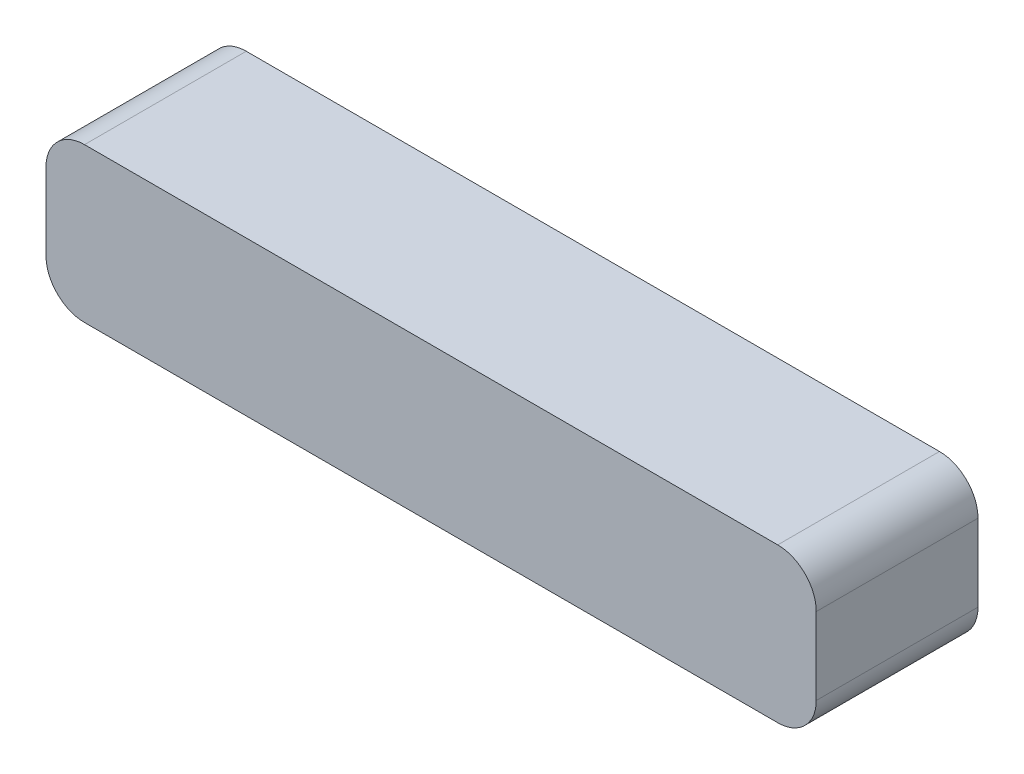
ISO-10303-21;
HEADER;
FILE_DESCRIPTION(('STEP AP214'),'2;1');
FILE_NAME('part.step','',(''),(''),'','','');
FILE_SCHEMA(('AUTOMOTIVE_DESIGN { 1 0 10303 214 1 1 1 1 }'));
ENDSEC;
DATA;
#1=APPLICATION_CONTEXT('core data for automotive mechanical design processes');
#2=APPLICATION_PROTOCOL_DEFINITION('international standard','automotive_design',2000,#1);
#3=PRODUCT_CONTEXT('',#1,'mechanical');
#4=PRODUCT('Part','Part','',(#3));
#5=PRODUCT_RELATED_PRODUCT_CATEGORY('part','',(#4));
#6=PRODUCT_DEFINITION_FORMATION('','',#4);
#7=PRODUCT_DEFINITION_CONTEXT('part definition',#1,'design');
#8=PRODUCT_DEFINITION('design','',#6,#7);
#9=PRODUCT_DEFINITION_SHAPE('','',#8);
#10=(LENGTH_UNIT() NAMED_UNIT(*) SI_UNIT(.MILLI.,.METRE.));
#11=(NAMED_UNIT(*) PLANE_ANGLE_UNIT() SI_UNIT($,.RADIAN.));
#12=(NAMED_UNIT(*) SI_UNIT($,.STERADIAN.) SOLID_ANGLE_UNIT());
#13=UNCERTAINTY_MEASURE_WITH_UNIT(LENGTH_MEASURE(1.E-05),#10,'distance_accuracy_value','');
#14=(GEOMETRIC_REPRESENTATION_CONTEXT(3) GLOBAL_UNCERTAINTY_ASSIGNED_CONTEXT((#13)) GLOBAL_UNIT_ASSIGNED_CONTEXT((#10,
#11,#12)) REPRESENTATION_CONTEXT('',''));
#15=CARTESIAN_POINT('',(0.,0.,0.));
#16=DIRECTION('',(0.,0.,1.));
#17=DIRECTION('',(1.,0.,0.));
#18=AXIS2_PLACEMENT_3D('',#15,#16,#17);
#19=CARTESIAN_POINT('',(-45.,9.,0.));
#20=DIRECTION('',(0.,-1.,0.));
#21=DIRECTION('',(0.,0.,-1.));
#22=AXIS2_PLACEMENT_3D('',#19,#20,#21);
#23=PLANE('',#22);
#24=DIRECTION('',(0.,0.,1.));
#25=VECTOR('',#24,1.);
#26=CARTESIAN_POINT('',(-45.,9.,10.));
#27=LINE('',#26,#25);
#28=CARTESIAN_POINT('',(-45.,9.,0.));
#29=VERTEX_POINT('',#28);
#30=CARTESIAN_POINT('',(-45.,9.,20.));
#31=VERTEX_POINT('',#30);
#32=EDGE_CURVE('E216',#29,#31,#27,.T.);
#33=ORIENTED_EDGE('',*,*,#32,.F.);
#34=DIRECTION('',(1.,0.,0.));
#35=VECTOR('',#34,1.);
#36=CARTESIAN_POINT('',(0.,9.,0.));
#37=LINE('',#36,#35);
#38=CARTESIAN_POINT('',(45.,9.,0.));
#39=VERTEX_POINT('',#38);
#40=EDGE_CURVE('E234',#29,#39,#37,.T.);
#41=ORIENTED_EDGE('',*,*,#40,.T.);
#42=DIRECTION('',(0.,0.,1.));
#43=VECTOR('',#42,1.);
#44=CARTESIAN_POINT('',(45.,9.,10.));
#45=LINE('',#44,#43);
#46=CARTESIAN_POINT('',(45.,9.,20.));
#47=VERTEX_POINT('',#46);
#48=EDGE_CURVE('E11',#39,#47,#45,.T.);
#49=ORIENTED_EDGE('',*,*,#48,.T.);
#50=DIRECTION('',(1.,0.,0.));
#51=VECTOR('',#50,1.);
#52=CARTESIAN_POINT('',(0.,9.,20.));
#53=LINE('',#52,#51);
#54=EDGE_CURVE('E323',#31,#47,#53,.T.);
#55=ORIENTED_EDGE('',*,*,#54,.F.);
#56=EDGE_LOOP('',(#33,#41,#49,#55));
#57=FACE_BOUND('',#56,.T.);
#58=ADVANCED_FACE('F17',(#57),#23,.T.);
#59=CARTESIAN_POINT('',(45.,5.,10.));
#60=DIRECTION('',(0.,0.,1.));
#61=DIRECTION('',(1.,0.,0.));
#62=AXIS2_PLACEMENT_3D('',#59,#60,#61);
#63=CYLINDRICAL_SURFACE('',#62,4.);
#64=CARTESIAN_POINT('',(45.,5.,20.));
#65=DIRECTION('',(0.,0.,1.));
#66=DIRECTION('',(1.,0.,0.));
#67=AXIS2_PLACEMENT_3D('',#64,#65,#66);
#68=CIRCLE('',#67,4.);
#69=CARTESIAN_POINT('',(49.,5.,20.));
#70=VERTEX_POINT('',#69);
#71=EDGE_CURVE('E327',#70,#47,#68,.T.);
#72=ORIENTED_EDGE('',*,*,#71,.T.);
#73=ORIENTED_EDGE('',*,*,#48,.F.);
#74=CARTESIAN_POINT('',(45.,5.,0.));
#75=DIRECTION('',(0.,0.,1.));
#76=DIRECTION('',(1.,0.,0.));
#77=AXIS2_PLACEMENT_3D('',#74,#75,#76);
#78=CIRCLE('',#77,4.);
#79=CARTESIAN_POINT('',(49.,5.,0.));
#80=VERTEX_POINT('',#79);
#81=EDGE_CURVE('E341',#80,#39,#78,.T.);
#82=ORIENTED_EDGE('',*,*,#81,.F.);
#83=DIRECTION('',(0.,0.,1.));
#84=VECTOR('',#83,1.);
#85=CARTESIAN_POINT('',(49.,5.,10.));
#86=LINE('',#85,#84);
#87=EDGE_CURVE('E28',#80,#70,#86,.T.);
#88=ORIENTED_EDGE('',*,*,#87,.T.);
#89=EDGE_LOOP('',(#72,#73,#82,#88));
#90=FACE_BOUND('',#89,.T.);
#91=ADVANCED_FACE('F19',(#90),#63,.F.);
#92=CARTESIAN_POINT('',(49.,-5.,0.));
#93=DIRECTION('',(1.,0.,0.));
#94=DIRECTION('',(0.,1.,0.));
#95=AXIS2_PLACEMENT_3D('',#92,#93,#94);
#96=PLANE('',#95);
#97=DIRECTION('',(0.,1.,0.));
#98=VECTOR('',#97,1.);
#99=CARTESIAN_POINT('',(49.,0.,20.));
#100=LINE('',#99,#98);
#101=CARTESIAN_POINT('',(49.,-5.,20.));
#102=VERTEX_POINT('',#101);
#103=EDGE_CURVE('E277',#102,#70,#100,.T.);
#104=ORIENTED_EDGE('',*,*,#103,.T.);
#105=ORIENTED_EDGE('',*,*,#87,.F.);
#106=DIRECTION('',(0.,1.,0.));
#107=VECTOR('',#106,1.);
#108=CARTESIAN_POINT('',(49.,0.,0.));
#109=LINE('',#108,#107);
#110=CARTESIAN_POINT('',(49.,-5.,0.));
#111=VERTEX_POINT('',#110);
#112=EDGE_CURVE('E337',#111,#80,#109,.T.);
#113=ORIENTED_EDGE('',*,*,#112,.F.);
#114=DIRECTION('',(0.,0.,1.));
#115=VECTOR('',#114,1.);
#116=CARTESIAN_POINT('',(49.,-5.,10.));
#117=LINE('',#116,#115);
#118=EDGE_CURVE('E291',#111,#102,#117,.T.);
#119=ORIENTED_EDGE('',*,*,#118,.T.);
#120=EDGE_LOOP('',(#104,#105,#113,#119));
#121=FACE_BOUND('',#120,.T.);
#122=ADVANCED_FACE('F508',(#121),#96,.F.);
#123=CARTESIAN_POINT('',(45.,-5.,10.));
#124=DIRECTION('',(0.,0.,1.));
#125=DIRECTION('',(0.,-1.,0.));
#126=AXIS2_PLACEMENT_3D('',#123,#124,#125);
#127=CYLINDRICAL_SURFACE('',#126,4.);
#128=CARTESIAN_POINT('',(45.,-5.,20.));
#129=DIRECTION('',(0.,0.,1.));
#130=DIRECTION('',(1.,0.,0.));
#131=AXIS2_PLACEMENT_3D('',#128,#129,#130);
#132=CIRCLE('',#131,4.);
#133=CARTESIAN_POINT('',(45.,-9.,20.));
#134=VERTEX_POINT('',#133);
#135=EDGE_CURVE('E272',#134,#102,#132,.T.);
#136=ORIENTED_EDGE('',*,*,#135,.T.);
#137=ORIENTED_EDGE('',*,*,#118,.F.);
#138=CARTESIAN_POINT('',(45.,-5.,0.));
#139=DIRECTION('',(0.,0.,1.));
#140=DIRECTION('',(1.,0.,0.));
#141=AXIS2_PLACEMENT_3D('',#138,#139,#140);
#142=CIRCLE('',#141,4.);
#143=CARTESIAN_POINT('',(45.,-9.,0.));
#144=VERTEX_POINT('',#143);
#145=EDGE_CURVE('E342',#144,#111,#142,.T.);
#146=ORIENTED_EDGE('',*,*,#145,.F.);
#147=DIRECTION('',(0.,0.,1.));
#148=VECTOR('',#147,1.);
#149=CARTESIAN_POINT('',(45.,-9.,10.));
#150=LINE('',#149,#148);
#151=EDGE_CURVE('E289',#144,#134,#150,.T.);
#152=ORIENTED_EDGE('',*,*,#151,.T.);
#153=EDGE_LOOP('',(#136,#137,#146,#152));
#154=FACE_BOUND('',#153,.T.);
#155=ADVANCED_FACE('F562',(#154),#127,.F.);
#156=CARTESIAN_POINT('',(45.,-9.,0.));
#157=DIRECTION('',(0.,1.,0.));
#158=DIRECTION('',(1.,0.,0.));
#159=AXIS2_PLACEMENT_3D('',#156,#157,#158);
#160=PLANE('',#159);
#161=ORIENTED_EDGE('',*,*,#151,.F.);
#162=DIRECTION('',(-1.,0.,0.));
#163=VECTOR('',#162,1.);
#164=CARTESIAN_POINT('',(0.,-9.,0.));
#165=LINE('',#164,#163);
#166=CARTESIAN_POINT('',(-45.,-9.,0.));
#167=VERTEX_POINT('',#166);
#168=EDGE_CURVE('E296',#144,#167,#165,.T.);
#169=ORIENTED_EDGE('',*,*,#168,.T.);
#170=DIRECTION('',(0.,0.,1.));
#171=VECTOR('',#170,1.);
#172=CARTESIAN_POINT('',(-45.,-9.,10.));
#173=LINE('',#172,#171);
#174=CARTESIAN_POINT('',(-45.,-9.,20.));
#175=VERTEX_POINT('',#174);
#176=EDGE_CURVE('E292',#167,#175,#173,.T.);
#177=ORIENTED_EDGE('',*,*,#176,.T.);
#178=DIRECTION('',(-1.,0.,0.));
#179=VECTOR('',#178,1.);
#180=CARTESIAN_POINT('',(0.,-9.,20.));
#181=LINE('',#180,#179);
#182=EDGE_CURVE('E276',#134,#175,#181,.T.);
#183=ORIENTED_EDGE('',*,*,#182,.F.);
#184=EDGE_LOOP('',(#161,#169,#177,#183));
#185=FACE_BOUND('',#184,.T.);
#186=ADVANCED_FACE('F566',(#185),#160,.T.);
#187=CARTESIAN_POINT('',(-45.,-5.,10.));
#188=DIRECTION('',(0.,0.,1.));
#189=DIRECTION('',(-1.,0.,0.));
#190=AXIS2_PLACEMENT_3D('',#187,#188,#189);
#191=CYLINDRICAL_SURFACE('',#190,4.);
#192=CARTESIAN_POINT('',(-45.,-5.,20.));
#193=DIRECTION('',(0.,0.,1.));
#194=DIRECTION('',(1.,0.,0.));
#195=AXIS2_PLACEMENT_3D('',#192,#193,#194);
#196=CIRCLE('',#195,4.);
#197=CARTESIAN_POINT('',(-49.,-5.,20.));
#198=VERTEX_POINT('',#197);
#199=EDGE_CURVE('E348',#198,#175,#196,.T.);
#200=ORIENTED_EDGE('',*,*,#199,.T.);
#201=ORIENTED_EDGE('',*,*,#176,.F.);
#202=CARTESIAN_POINT('',(-45.,-5.,0.));
#203=DIRECTION('',(0.,0.,1.));
#204=DIRECTION('',(1.,0.,0.));
#205=AXIS2_PLACEMENT_3D('',#202,#203,#204);
#206=CIRCLE('',#205,4.);
#207=CARTESIAN_POINT('',(-49.,-5.,0.));
#208=VERTEX_POINT('',#207);
#209=EDGE_CURVE('E227',#208,#167,#206,.T.);
#210=ORIENTED_EDGE('',*,*,#209,.F.);
#211=DIRECTION('',(0.,0.,1.));
#212=VECTOR('',#211,1.);
#213=CARTESIAN_POINT('',(-49.,-5.,10.));
#214=LINE('',#213,#212);
#215=EDGE_CURVE('E222',#208,#198,#214,.T.);
#216=ORIENTED_EDGE('',*,*,#215,.T.);
#217=EDGE_LOOP('',(#200,#201,#210,#216));
#218=FACE_BOUND('',#217,.T.);
#219=ADVANCED_FACE('F613',(#218),#191,.F.);
#220=CARTESIAN_POINT('',(-49.,5.,0.));
#221=DIRECTION('',(-1.,0.,0.));
#222=DIRECTION('',(0.,0.,1.));
#223=AXIS2_PLACEMENT_3D('',#220,#221,#222);
#224=PLANE('',#223);
#225=DIRECTION('',(0.,-1.,0.));
#226=VECTOR('',#225,1.);
#227=CARTESIAN_POINT('',(-49.,0.,20.));
#228=LINE('',#227,#226);
#229=CARTESIAN_POINT('',(-49.,5.,20.));
#230=VERTEX_POINT('',#229);
#231=EDGE_CURVE('E266',#230,#198,#228,.T.);
#232=ORIENTED_EDGE('',*,*,#231,.T.);
#233=ORIENTED_EDGE('',*,*,#215,.F.);
#234=DIRECTION('',(0.,-1.,0.));
#235=VECTOR('',#234,1.);
#236=CARTESIAN_POINT('',(-49.,0.,0.));
#237=LINE('',#236,#235);
#238=CARTESIAN_POINT('',(-49.,5.,0.));
#239=VERTEX_POINT('',#238);
#240=EDGE_CURVE('E220',#239,#208,#237,.T.);
#241=ORIENTED_EDGE('',*,*,#240,.F.);
#242=DIRECTION('',(0.,0.,1.));
#243=VECTOR('',#242,1.);
#244=CARTESIAN_POINT('',(-49.,5.,10.));
#245=LINE('',#244,#243);
#246=EDGE_CURVE('E205',#239,#230,#245,.T.);
#247=ORIENTED_EDGE('',*,*,#246,.T.);
#248=EDGE_LOOP('',(#232,#233,#241,#247));
#249=FACE_BOUND('',#248,.T.);
#250=ADVANCED_FACE('F221',(#249),#224,.F.);
#251=CARTESIAN_POINT('',(-45.,5.,10.));
#252=DIRECTION('',(0.,0.,1.));
#253=DIRECTION('',(0.,1.,0.));
#254=AXIS2_PLACEMENT_3D('',#251,#252,#253);
#255=CYLINDRICAL_SURFACE('',#254,4.);
#256=CARTESIAN_POINT('',(-45.,5.,20.));
#257=DIRECTION('',(0.,0.,1.));
#258=DIRECTION('',(1.,0.,0.));
#259=AXIS2_PLACEMENT_3D('',#256,#257,#258);
#260=CIRCLE('',#259,4.);
#261=EDGE_CURVE('E211',#31,#230,#260,.T.);
#262=ORIENTED_EDGE('',*,*,#261,.T.);
#263=ORIENTED_EDGE('',*,*,#246,.F.);
#264=CARTESIAN_POINT('',(-45.,5.,0.));
#265=DIRECTION('',(0.,0.,1.));
#266=DIRECTION('',(1.,0.,0.));
#267=AXIS2_PLACEMENT_3D('',#264,#265,#266);
#268=CIRCLE('',#267,4.);
#269=EDGE_CURVE('E209',#29,#239,#268,.T.);
#270=ORIENTED_EDGE('',*,*,#269,.F.);
#271=ORIENTED_EDGE('',*,*,#32,.T.);
#272=EDGE_LOOP('',(#262,#263,#270,#271));
#273=FACE_BOUND('',#272,.T.);
#274=ADVANCED_FACE('F207',(#273),#255,.F.);
#275=CARTESIAN_POINT('',(-50.,5.,0.));
#276=DIRECTION('',(-1.,0.,0.));
#277=DIRECTION('',(0.,0.,1.));
#278=AXIS2_PLACEMENT_3D('',#275,#276,#277);
#279=PLANE('',#278);
#280=DIRECTION('',(0.,0.,1.));
#281=VECTOR('',#280,1.);
#282=CARTESIAN_POINT('',(-50.,5.,20.));
#283=LINE('',#282,#281);
#284=CARTESIAN_POINT('',(-50.,5.,0.));
#285=VERTEX_POINT('',#284);
#286=CARTESIAN_POINT('',(-50.,5.,21.));
#287=VERTEX_POINT('',#286);
#288=EDGE_CURVE('E217',#285,#287,#283,.T.);
#289=ORIENTED_EDGE('',*,*,#288,.F.);
#290=DIRECTION('',(0.,-1.,0.));
#291=VECTOR('',#290,1.);
#292=CARTESIAN_POINT('',(-50.,0.,0.));
#293=LINE('',#292,#291);
#294=CARTESIAN_POINT('',(-50.,-5.,0.));
#295=VERTEX_POINT('',#294);
#296=EDGE_CURVE('E336',#285,#295,#293,.T.);
#297=ORIENTED_EDGE('',*,*,#296,.T.);
#298=DIRECTION('',(0.,0.,1.));
#299=VECTOR('',#298,1.);
#300=CARTESIAN_POINT('',(-50.,-5.,20.));
#301=LINE('',#300,#299);
#302=CARTESIAN_POINT('',(-50.,-5.,21.));
#303=VERTEX_POINT('',#302);
#304=EDGE_CURVE('E271',#295,#303,#301,.T.);
#305=ORIENTED_EDGE('',*,*,#304,.T.);
#306=DIRECTION('',(0.,-1.,0.));
#307=VECTOR('',#306,1.);
#308=CARTESIAN_POINT('',(-50.,0.,21.));
#309=LINE('',#308,#307);
#310=EDGE_CURVE('E252',#287,#303,#309,.T.);
#311=ORIENTED_EDGE('',*,*,#310,.F.);
#312=EDGE_LOOP('',(#289,#297,#305,#311));
#313=FACE_BOUND('',#312,.T.);
#314=ADVANCED_FACE('F458',(#313),#279,.T.);
#315=CARTESIAN_POINT('',(-45.,5.,10.));
#316=DIRECTION('',(0.,0.,1.));
#317=DIRECTION('',(0.,1.,0.));
#318=AXIS2_PLACEMENT_3D('',#315,#316,#317);
#319=CYLINDRICAL_SURFACE('',#318,5.);
#320=DIRECTION('',(0.,0.,1.));
#321=VECTOR('',#320,1.);
#322=CARTESIAN_POINT('',(-45.,10.,10.5));
#323=LINE('',#322,#321);
#324=CARTESIAN_POINT('',(-45.,10.,0.));
#325=VERTEX_POINT('',#324);
#326=CARTESIAN_POINT('',(-45.,10.,21.));
#327=VERTEX_POINT('',#326);
#328=EDGE_CURVE('E304',#325,#327,#323,.T.);
#329=ORIENTED_EDGE('',*,*,#328,.F.);
#330=CARTESIAN_POINT('',(-45.,5.,0.));
#331=DIRECTION('',(0.,0.,1.));
#332=DIRECTION('',(1.,0.,0.));
#333=AXIS2_PLACEMENT_3D('',#330,#331,#332);
#334=CIRCLE('',#333,5.);
#335=EDGE_CURVE('E21',#325,#285,#334,.T.);
#336=ORIENTED_EDGE('',*,*,#335,.T.);
#337=ORIENTED_EDGE('',*,*,#288,.T.);
#338=CARTESIAN_POINT('',(-45.,5.,21.));
#339=DIRECTION('',(0.,0.,1.));
#340=DIRECTION('',(1.,0.,0.));
#341=AXIS2_PLACEMENT_3D('',#338,#339,#340);
#342=CIRCLE('',#341,5.);
#343=EDGE_CURVE('E299',#327,#287,#342,.T.);
#344=ORIENTED_EDGE('',*,*,#343,.F.);
#345=EDGE_LOOP('',(#329,#336,#337,#344));
#346=FACE_BOUND('',#345,.T.);
#347=ADVANCED_FACE('F462',(#346),#319,.T.);
#348=CARTESIAN_POINT('',(-45.,10.,0.));
#349=DIRECTION('',(0.,-1.,0.));
#350=DIRECTION('',(0.,0.,-1.));
#351=AXIS2_PLACEMENT_3D('',#348,#349,#350);
#352=PLANE('',#351);
#353=DIRECTION('',(0.,0.,1.));
#354=VECTOR('',#353,1.);
#355=CARTESIAN_POINT('',(45.,10.,20.));
#356=LINE('',#355,#354);
#357=CARTESIAN_POINT('',(45.,10.,0.));
#358=VERTEX_POINT('',#357);
#359=CARTESIAN_POINT('',(45.,10.,21.));
#360=VERTEX_POINT('',#359);
#361=EDGE_CURVE('E308',#358,#360,#356,.T.);
#362=ORIENTED_EDGE('',*,*,#361,.F.);
#363=DIRECTION('',(1.,0.,0.));
#364=VECTOR('',#363,1.);
#365=CARTESIAN_POINT('',(0.,10.,0.));
#366=LINE('',#365,#364);
#367=EDGE_CURVE('E236',#325,#358,#366,.T.);
#368=ORIENTED_EDGE('',*,*,#367,.F.);
#369=ORIENTED_EDGE('',*,*,#328,.T.);
#370=DIRECTION('',(-1.,0.,0.));
#371=VECTOR('',#370,1.);
#372=CARTESIAN_POINT('',(0.,10.,21.));
#373=LINE('',#372,#371);
#374=EDGE_CURVE('E303',#360,#327,#373,.T.);
#375=ORIENTED_EDGE('',*,*,#374,.F.);
#376=EDGE_LOOP('',(#362,#368,#369,#375));
#377=FACE_BOUND('',#376,.T.);
#378=ADVANCED_FACE('F437',(#377),#352,.F.);
#379=CARTESIAN_POINT('',(45.,5.,10.));
#380=DIRECTION('',(0.,0.,1.));
#381=DIRECTION('',(1.,0.,0.));
#382=AXIS2_PLACEMENT_3D('',#379,#380,#381);
#383=CYLINDRICAL_SURFACE('',#382,5.);
#384=DIRECTION('',(0.,0.,1.));
#385=VECTOR('',#384,1.);
#386=CARTESIAN_POINT('',(50.,5.,10.5));
#387=LINE('',#386,#385);
#388=CARTESIAN_POINT('',(50.,5.,0.));
#389=VERTEX_POINT('',#388);
#390=CARTESIAN_POINT('',(50.,5.,21.));
#391=VERTEX_POINT('',#390);
#392=EDGE_CURVE('E255',#389,#391,#387,.T.);
#393=ORIENTED_EDGE('',*,*,#392,.F.);
#394=CARTESIAN_POINT('',(45.,5.,0.));
#395=DIRECTION('',(0.,0.,1.));
#396=DIRECTION('',(1.,0.,0.));
#397=AXIS2_PLACEMENT_3D('',#394,#395,#396);
#398=CIRCLE('',#397,5.);
#399=EDGE_CURVE('E387',#389,#358,#398,.T.);
#400=ORIENTED_EDGE('',*,*,#399,.T.);
#401=ORIENTED_EDGE('',*,*,#361,.T.);
#402=CARTESIAN_POINT('',(45.,5.,21.));
#403=DIRECTION('',(0.,0.,1.));
#404=DIRECTION('',(1.,0.,0.));
#405=AXIS2_PLACEMENT_3D('',#402,#403,#404);
#406=CIRCLE('',#405,5.);
#407=EDGE_CURVE('E261',#391,#360,#406,.T.);
#408=ORIENTED_EDGE('',*,*,#407,.F.);
#409=EDGE_LOOP('',(#393,#400,#401,#408));
#410=FACE_BOUND('',#409,.T.);
#411=ADVANCED_FACE('F433',(#410),#383,.T.);
#412=CARTESIAN_POINT('',(-45.,-5.,10.));
#413=DIRECTION('',(0.,0.,1.));
#414=DIRECTION('',(-1.,0.,0.));
#415=AXIS2_PLACEMENT_3D('',#412,#413,#414);
#416=CYLINDRICAL_SURFACE('',#415,5.);
#417=ORIENTED_EDGE('',*,*,#304,.F.);
#418=CARTESIAN_POINT('',(-45.,-5.,0.));
#419=DIRECTION('',(0.,0.,1.));
#420=DIRECTION('',(1.,0.,0.));
#421=AXIS2_PLACEMENT_3D('',#418,#419,#420);
#422=CIRCLE('',#421,5.);
#423=CARTESIAN_POINT('',(-45.,-10.,0.));
#424=VERTEX_POINT('',#423);
#425=EDGE_CURVE('E288',#295,#424,#422,.T.);
#426=ORIENTED_EDGE('',*,*,#425,.T.);
#427=DIRECTION('',(0.,0.,1.));
#428=VECTOR('',#427,1.);
#429=CARTESIAN_POINT('',(-45.,-10.,10.5));
#430=LINE('',#429,#428);
#431=CARTESIAN_POINT('',(-45.,-10.,21.));
#432=VERTEX_POINT('',#431);
#433=EDGE_CURVE('E42',#424,#432,#430,.T.);
#434=ORIENTED_EDGE('',*,*,#433,.T.);
#435=CARTESIAN_POINT('',(-45.,-5.,21.));
#436=DIRECTION('',(0.,0.,1.));
#437=DIRECTION('',(1.,0.,0.));
#438=AXIS2_PLACEMENT_3D('',#435,#436,#437);
#439=CIRCLE('',#438,5.);
#440=EDGE_CURVE('E248',#303,#432,#439,.T.);
#441=ORIENTED_EDGE('',*,*,#440,.F.);
#442=EDGE_LOOP('',(#417,#426,#434,#441));
#443=FACE_BOUND('',#442,.T.);
#444=ADVANCED_FACE('F461',(#443),#416,.T.);
#445=CARTESIAN_POINT('',(50.,-5.,0.));
#446=DIRECTION('',(1.,0.,0.));
#447=DIRECTION('',(0.,1.,0.));
#448=AXIS2_PLACEMENT_3D('',#445,#446,#447);
#449=PLANE('',#448);
#450=DIRECTION('',(0.,0.,1.));
#451=VECTOR('',#450,1.);
#452=CARTESIAN_POINT('',(50.,-5.,20.));
#453=LINE('',#452,#451);
#454=CARTESIAN_POINT('',(50.,-5.,0.));
#455=VERTEX_POINT('',#454);
#456=CARTESIAN_POINT('',(50.,-5.,21.));
#457=VERTEX_POINT('',#456);
#458=EDGE_CURVE('E256',#455,#457,#453,.T.);
#459=ORIENTED_EDGE('',*,*,#458,.F.);
#460=DIRECTION('',(0.,1.,0.));
#461=VECTOR('',#460,1.);
#462=CARTESIAN_POINT('',(50.,0.,0.));
#463=LINE('',#462,#461);
#464=EDGE_CURVE('E390',#455,#389,#463,.T.);
#465=ORIENTED_EDGE('',*,*,#464,.T.);
#466=ORIENTED_EDGE('',*,*,#392,.T.);
#467=DIRECTION('',(0.,1.,0.));
#468=VECTOR('',#467,1.);
#469=CARTESIAN_POINT('',(50.,0.,21.));
#470=LINE('',#469,#468);
#471=EDGE_CURVE('E257',#457,#391,#470,.T.);
#472=ORIENTED_EDGE('',*,*,#471,.F.);
#473=EDGE_LOOP('',(#459,#465,#466,#472));
#474=FACE_BOUND('',#473,.T.);
#475=ADVANCED_FACE('F444',(#474),#449,.T.);
#476=CARTESIAN_POINT('',(45.,-10.,0.));
#477=DIRECTION('',(0.,1.,0.));
#478=DIRECTION('',(1.,0.,0.));
#479=AXIS2_PLACEMENT_3D('',#476,#477,#478);
#480=PLANE('',#479);
#481=ORIENTED_EDGE('',*,*,#433,.F.);
#482=DIRECTION('',(-1.,0.,0.));
#483=VECTOR('',#482,1.);
#484=CARTESIAN_POINT('',(0.,-10.,0.));
#485=LINE('',#484,#483);
#486=CARTESIAN_POINT('',(45.,-10.,0.));
#487=VERTEX_POINT('',#486);
#488=EDGE_CURVE('E284',#487,#424,#485,.T.);
#489=ORIENTED_EDGE('',*,*,#488,.F.);
#490=DIRECTION('',(0.,0.,1.));
#491=VECTOR('',#490,1.);
#492=CARTESIAN_POINT('',(45.,-10.,20.));
#493=LINE('',#492,#491);
#494=CARTESIAN_POINT('',(45.,-10.,21.));
#495=VERTEX_POINT('',#494);
#496=EDGE_CURVE('E265',#487,#495,#493,.T.);
#497=ORIENTED_EDGE('',*,*,#496,.T.);
#498=DIRECTION('',(1.,0.,0.));
#499=VECTOR('',#498,1.);
#500=CARTESIAN_POINT('',(0.,-10.,21.));
#501=LINE('',#500,#499);
#502=EDGE_CURVE('E251',#432,#495,#501,.T.);
#503=ORIENTED_EDGE('',*,*,#502,.F.);
#504=EDGE_LOOP('',(#481,#489,#497,#503));
#505=FACE_BOUND('',#504,.T.);
#506=ADVANCED_FACE('F631',(#505),#480,.F.);
#507=CARTESIAN_POINT('',(45.,-5.,10.));
#508=DIRECTION('',(0.,0.,1.));
#509=DIRECTION('',(0.,-1.,0.));
#510=AXIS2_PLACEMENT_3D('',#507,#508,#509);
#511=CYLINDRICAL_SURFACE('',#510,5.);
#512=ORIENTED_EDGE('',*,*,#496,.F.);
#513=CARTESIAN_POINT('',(45.,-5.,0.));
#514=DIRECTION('',(0.,0.,1.));
#515=DIRECTION('',(1.,0.,0.));
#516=AXIS2_PLACEMENT_3D('',#513,#514,#515);
#517=CIRCLE('',#516,5.);
#518=EDGE_CURVE('E246',#487,#455,#517,.T.);
#519=ORIENTED_EDGE('',*,*,#518,.T.);
#520=ORIENTED_EDGE('',*,*,#458,.T.);
#521=CARTESIAN_POINT('',(45.,-5.,21.));
#522=DIRECTION('',(0.,0.,1.));
#523=DIRECTION('',(1.,0.,0.));
#524=AXIS2_PLACEMENT_3D('',#521,#522,#523);
#525=CIRCLE('',#524,5.);
#526=EDGE_CURVE('E262',#495,#457,#525,.T.);
#527=ORIENTED_EDGE('',*,*,#526,.F.);
#528=EDGE_LOOP('',(#512,#519,#520,#527));
#529=FACE_BOUND('',#528,.T.);
#530=ADVANCED_FACE('F627',(#529),#511,.T.);
#531=CARTESIAN_POINT('',(0.,0.,21.));
#532=DIRECTION('',(0.,0.,1.));
#533=DIRECTION('',(1.,0.,0.));
#534=AXIS2_PLACEMENT_3D('',#531,#532,#533);
#535=PLANE('',#534);
#536=ORIENTED_EDGE('',*,*,#526,.T.);
#537=ORIENTED_EDGE('',*,*,#471,.T.);
#538=ORIENTED_EDGE('',*,*,#407,.T.);
#539=ORIENTED_EDGE('',*,*,#374,.T.);
#540=ORIENTED_EDGE('',*,*,#343,.T.);
#541=ORIENTED_EDGE('',*,*,#310,.T.);
#542=ORIENTED_EDGE('',*,*,#440,.T.);
#543=ORIENTED_EDGE('',*,*,#502,.T.);
#544=EDGE_LOOP('',(#536,#537,#538,#539,#540,#541,#542,#543));
#545=FACE_BOUND('',#544,.T.);
#546=ADVANCED_FACE('F440',(#545),#535,.T.);
#547=CARTESIAN_POINT('',(0.,0.,0.));
#548=DIRECTION('',(0.,0.,1.));
#549=DIRECTION('',(1.,0.,0.));
#550=AXIS2_PLACEMENT_3D('',#547,#548,#549);
#551=PLANE('',#550);
#552=ORIENTED_EDGE('',*,*,#269,.T.);
#553=ORIENTED_EDGE('',*,*,#240,.T.);
#554=ORIENTED_EDGE('',*,*,#209,.T.);
#555=ORIENTED_EDGE('',*,*,#168,.F.);
#556=ORIENTED_EDGE('',*,*,#145,.T.);
#557=ORIENTED_EDGE('',*,*,#112,.T.);
#558=ORIENTED_EDGE('',*,*,#81,.T.);
#559=ORIENTED_EDGE('',*,*,#40,.F.);
#560=EDGE_LOOP('',(#552,#553,#554,#555,#556,#557,#558,#559));
#561=FACE_BOUND('',#560,.T.);
#562=ORIENTED_EDGE('',*,*,#399,.F.);
#563=ORIENTED_EDGE('',*,*,#464,.F.);
#564=ORIENTED_EDGE('',*,*,#518,.F.);
#565=ORIENTED_EDGE('',*,*,#488,.T.);
#566=ORIENTED_EDGE('',*,*,#425,.F.);
#567=ORIENTED_EDGE('',*,*,#296,.F.);
#568=ORIENTED_EDGE('',*,*,#335,.F.);
#569=ORIENTED_EDGE('',*,*,#367,.T.);
#570=EDGE_LOOP('',(#562,#563,#564,#565,#566,#567,#568,#569));
#571=FACE_BOUND('',#570,.T.);
#572=ADVANCED_FACE('F230',(#561,#571),#551,.F.);
#573=CARTESIAN_POINT('',(0.,0.,20.));
#574=DIRECTION('',(0.,0.,1.));
#575=DIRECTION('',(1.,0.,0.));
#576=AXIS2_PLACEMENT_3D('',#573,#574,#575);
#577=PLANE('',#576);
#578=CARTESIAN_POINT('',(0.,0.,20.));
#579=DIRECTION('',(0.,0.,-1.));
#580=DIRECTION('',(1.,0.,0.));
#581=AXIS2_PLACEMENT_3D('',#578,#579,#580);
#582=CIRCLE('',#581,8.5);
#583=CARTESIAN_POINT('',(-8.5,0.,20.));
#584=VERTEX_POINT('',#583);
#585=CARTESIAN_POINT('',(8.5,0.,20.));
#586=VERTEX_POINT('',#585);
#587=EDGE_CURVE('E281',#584,#586,#582,.T.);
#588=ORIENTED_EDGE('',*,*,#587,.F.);
#589=CARTESIAN_POINT('',(0.,0.,20.));
#590=DIRECTION('',(0.,0.,-1.));
#591=DIRECTION('',(1.,0.,0.));
#592=AXIS2_PLACEMENT_3D('',#589,#590,#591);
#593=CIRCLE('',#592,8.5);
#594=EDGE_CURVE('E318',#586,#584,#593,.T.);
#595=ORIENTED_EDGE('',*,*,#594,.F.);
#596=EDGE_LOOP('',(#588,#595));
#597=FACE_BOUND('',#596,.T.);
#598=ORIENTED_EDGE('',*,*,#231,.F.);
#599=ORIENTED_EDGE('',*,*,#261,.F.);
#600=ORIENTED_EDGE('',*,*,#54,.T.);
#601=ORIENTED_EDGE('',*,*,#71,.F.);
#602=ORIENTED_EDGE('',*,*,#103,.F.);
#603=ORIENTED_EDGE('',*,*,#135,.F.);
#604=ORIENTED_EDGE('',*,*,#182,.T.);
#605=ORIENTED_EDGE('',*,*,#199,.F.);
#606=EDGE_LOOP('',(#598,#599,#600,#601,#602,#603,#604,#605));
#607=FACE_BOUND('',#606,.T.);
#608=ADVANCED_FACE('F536',(#597,#607),#577,.F.);
#609=CARTESIAN_POINT('',(0.,0.,20.));
#610=DIRECTION('',(0.,0.,1.));
#611=DIRECTION('',(1.,0.,0.));
#612=AXIS2_PLACEMENT_3D('',#609,#610,#611);
#613=PLANE('',#612);
#614=CARTESIAN_POINT('',(0.,0.,20.));
#615=DIRECTION('',(0.,0.,-1.));
#616=DIRECTION('',(1.,0.,0.));
#617=AXIS2_PLACEMENT_3D('',#614,#615,#616);
#618=CIRCLE('',#617,7.5);
#619=CARTESIAN_POINT('',(7.5,0.,20.));
#620=VERTEX_POINT('',#619);
#621=CARTESIAN_POINT('',(-7.5,0.,20.));
#622=VERTEX_POINT('',#621);
#623=EDGE_CURVE('E311',#620,#622,#618,.T.);
#624=ORIENTED_EDGE('',*,*,#623,.T.);
#625=CARTESIAN_POINT('',(0.,0.,20.));
#626=DIRECTION('',(0.,0.,-1.));
#627=DIRECTION('',(1.,0.,0.));
#628=AXIS2_PLACEMENT_3D('',#625,#626,#627);
#629=CIRCLE('',#628,7.5);
#630=EDGE_CURVE('E156',#622,#620,#629,.T.);
#631=ORIENTED_EDGE('',*,*,#630,.T.);
#632=EDGE_LOOP('',(#624,#631));
#633=FACE_BOUND('',#632,.T.);
#634=ADVANCED_FACE('F540',(#633),#613,.F.);
#635=CARTESIAN_POINT('',(0.,0.,15.));
#636=DIRECTION('',(0.,0.,-1.));
#637=DIRECTION('',(-1.,0.,0.));
#638=AXIS2_PLACEMENT_3D('',#635,#636,#637);
#639=CYLINDRICAL_SURFACE('',#638,7.5);
#640=CARTESIAN_POINT('',(0.,0.,10.));
#641=DIRECTION('',(0.,0.,-1.));
#642=DIRECTION('',(1.,0.,0.));
#643=AXIS2_PLACEMENT_3D('',#640,#641,#642);
#644=CIRCLE('',#643,7.5);
#645=CARTESIAN_POINT('',(-7.5,0.,10.));
#646=VERTEX_POINT('',#645);
#647=CARTESIAN_POINT('',(7.5,0.,10.));
#648=VERTEX_POINT('',#647);
#649=EDGE_CURVE('E312',#646,#648,#644,.T.);
#650=ORIENTED_EDGE('',*,*,#649,.T.);
#651=DIRECTION('',(0.,0.,-1.));
#652=VECTOR('',#651,1.);
#653=CARTESIAN_POINT('',(7.5,0.,15.));
#654=LINE('',#653,#652);
#655=EDGE_CURVE('E360',#620,#648,#654,.T.);
#656=ORIENTED_EDGE('',*,*,#655,.F.);
#657=ORIENTED_EDGE('',*,*,#630,.F.);
#658=DIRECTION('',(0.,0.,-1.));
#659=VECTOR('',#658,1.);
#660=CARTESIAN_POINT('',(-7.5,0.,15.));
#661=LINE('',#660,#659);
#662=EDGE_CURVE('E163',#622,#646,#661,.T.);
#663=ORIENTED_EDGE('',*,*,#662,.T.);
#664=EDGE_LOOP('',(#650,#656,#657,#663));
#665=FACE_BOUND('',#664,.T.);
#666=ADVANCED_FACE('F582',(#665),#639,.F.);
#667=CARTESIAN_POINT('',(0.,0.,15.));
#668=DIRECTION('',(0.,0.,-1.));
#669=DIRECTION('',(-1.,0.,0.));
#670=AXIS2_PLACEMENT_3D('',#667,#668,#669);
#671=CYLINDRICAL_SURFACE('',#670,7.5);
#672=CARTESIAN_POINT('',(0.,0.,10.));
#673=DIRECTION('',(0.,0.,-1.));
#674=DIRECTION('',(1.,0.,0.));
#675=AXIS2_PLACEMENT_3D('',#672,#673,#674);
#676=CIRCLE('',#675,7.5);
#677=EDGE_CURVE('E317',#648,#646,#676,.T.);
#678=ORIENTED_EDGE('',*,*,#677,.T.);
#679=ORIENTED_EDGE('',*,*,#662,.F.);
#680=ORIENTED_EDGE('',*,*,#623,.F.);
#681=ORIENTED_EDGE('',*,*,#655,.T.);
#682=EDGE_LOOP('',(#678,#679,#680,#681));
#683=FACE_BOUND('',#682,.T.);
#684=ADVANCED_FACE('F523',(#683),#671,.F.);
#685=CARTESIAN_POINT('',(0.,0.,10.));
#686=DIRECTION('',(0.,0.,-1.));
#687=DIRECTION('',(0.,-1.,0.));
#688=AXIS2_PLACEMENT_3D('',#685,#686,#687);
#689=PLANE('',#688);
#690=ORIENTED_EDGE('',*,*,#677,.F.);
#691=ORIENTED_EDGE('',*,*,#649,.F.);
#692=EDGE_LOOP('',(#690,#691));
#693=FACE_BOUND('',#692,.T.);
#694=CARTESIAN_POINT('',(0.,0.,10.));
#695=DIRECTION('',(0.,0.,-1.));
#696=DIRECTION('',(1.,0.,0.));
#697=AXIS2_PLACEMENT_3D('',#694,#695,#696);
#698=CIRCLE('',#697,8.5);
#699=CARTESIAN_POINT('',(8.5,0.,10.));
#700=VERTEX_POINT('',#699);
#701=CARTESIAN_POINT('',(-8.5,0.,10.));
#702=VERTEX_POINT('',#701);
#703=EDGE_CURVE('E278',#700,#702,#698,.T.);
#704=ORIENTED_EDGE('',*,*,#703,.T.);
#705=CARTESIAN_POINT('',(0.,0.,10.));
#706=DIRECTION('',(0.,0.,-1.));
#707=DIRECTION('',(1.,0.,0.));
#708=AXIS2_PLACEMENT_3D('',#705,#706,#707);
#709=CIRCLE('',#708,8.5);
#710=EDGE_CURVE('E313',#702,#700,#709,.T.);
#711=ORIENTED_EDGE('',*,*,#710,.T.);
#712=EDGE_LOOP('',(#704,#711));
#713=FACE_BOUND('',#712,.T.);
#714=ADVANCED_FACE('F518',(#693,#713),#689,.T.);
#715=CARTESIAN_POINT('',(0.,0.,15.));
#716=DIRECTION('',(0.,0.,-1.));
#717=DIRECTION('',(1.,0.,0.));
#718=AXIS2_PLACEMENT_3D('',#715,#716,#717);
#719=CYLINDRICAL_SURFACE('',#718,8.5);
#720=DIRECTION('',(0.,0.,-1.));
#721=VECTOR('',#720,1.);
#722=CARTESIAN_POINT('',(-8.5,0.,15.));
#723=LINE('',#722,#721);
#724=EDGE_CURVE('E282',#584,#702,#723,.T.);
#725=ORIENTED_EDGE('',*,*,#724,.F.);
#726=ORIENTED_EDGE('',*,*,#587,.T.);
#727=DIRECTION('',(0.,0.,-1.));
#728=VECTOR('',#727,1.);
#729=CARTESIAN_POINT('',(8.5,0.,15.));
#730=LINE('',#729,#728);
#731=EDGE_CURVE('E322',#586,#700,#730,.T.);
#732=ORIENTED_EDGE('',*,*,#731,.T.);
#733=ORIENTED_EDGE('',*,*,#710,.F.);
#734=EDGE_LOOP('',(#725,#726,#732,#733));
#735=FACE_BOUND('',#734,.T.);
#736=ADVANCED_FACE('F522',(#735),#719,.T.);
#737=CARTESIAN_POINT('',(0.,0.,15.));
#738=DIRECTION('',(0.,0.,-1.));
#739=DIRECTION('',(1.,0.,0.));
#740=AXIS2_PLACEMENT_3D('',#737,#738,#739);
#741=CYLINDRICAL_SURFACE('',#740,8.5);
#742=ORIENTED_EDGE('',*,*,#731,.F.);
#743=ORIENTED_EDGE('',*,*,#594,.T.);
#744=ORIENTED_EDGE('',*,*,#724,.T.);
#745=ORIENTED_EDGE('',*,*,#703,.F.);
#746=EDGE_LOOP('',(#742,#743,#744,#745));
#747=FACE_BOUND('',#746,.T.);
#748=ADVANCED_FACE('F549',(#747),#741,.T.);
#749=CLOSED_SHELL('',(#58,#91,#122,#155,#186,#219,#250,#274,#314,#347,#378,#411,#444,#475,#506,
#530,#546,#572,#608,#634,#666,#684,#714,#736,#748));
#750=MANIFOLD_SOLID_BREP('B1',#749);
#751=ADVANCED_BREP_SHAPE_REPRESENTATION('',(#18,#750),#14);
#752=SHAPE_DEFINITION_REPRESENTATION(#9,#751);
ENDSEC;
END-ISO-10303-21;
